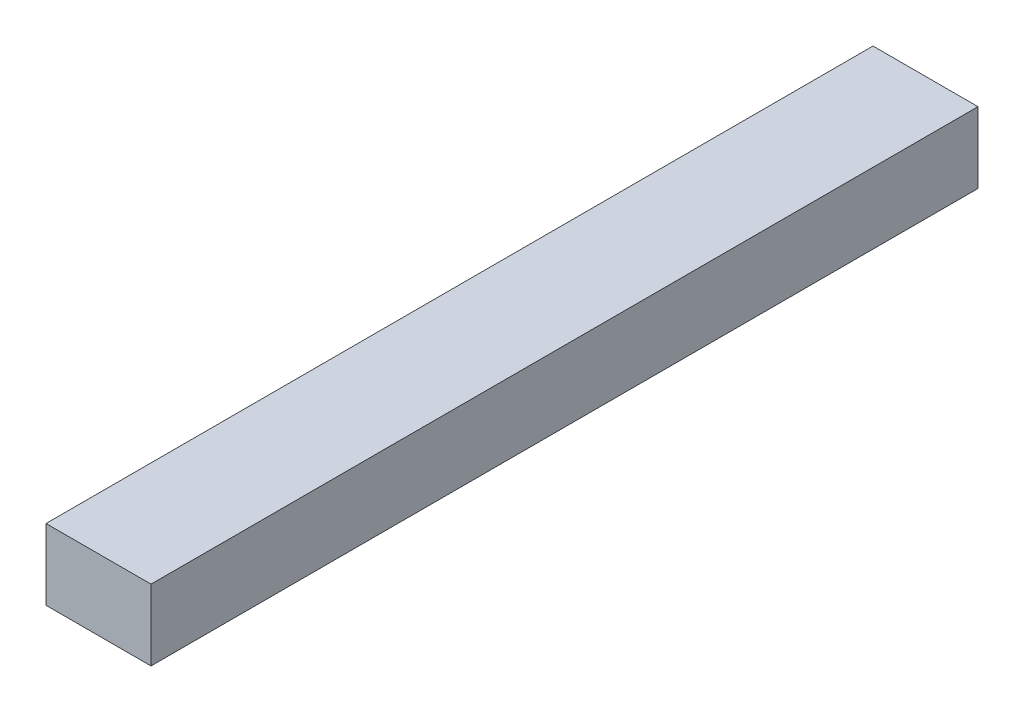
ISO-10303-21;
HEADER;
FILE_DESCRIPTION(('STEP AP214'),'2;1');
FILE_NAME('part.step','',(''),(''),'','','');
FILE_SCHEMA(('AUTOMOTIVE_DESIGN { 1 0 10303 214 1 1 1 1 }'));
ENDSEC;
DATA;
#1=APPLICATION_CONTEXT('core data for automotive mechanical design processes');
#2=APPLICATION_PROTOCOL_DEFINITION('international standard','automotive_design',2000,#1);
#3=PRODUCT_CONTEXT('',#1,'mechanical');
#4=PRODUCT('Part','Part','',(#3));
#5=PRODUCT_RELATED_PRODUCT_CATEGORY('part','',(#4));
#6=PRODUCT_DEFINITION_FORMATION('','',#4);
#7=PRODUCT_DEFINITION_CONTEXT('part definition',#1,'design');
#8=PRODUCT_DEFINITION('design','',#6,#7);
#9=PRODUCT_DEFINITION_SHAPE('','',#8);
#10=(LENGTH_UNIT() NAMED_UNIT(*) SI_UNIT(.MILLI.,.METRE.));
#11=(NAMED_UNIT(*) PLANE_ANGLE_UNIT() SI_UNIT($,.RADIAN.));
#12=(NAMED_UNIT(*) SI_UNIT($,.STERADIAN.) SOLID_ANGLE_UNIT());
#13=UNCERTAINTY_MEASURE_WITH_UNIT(LENGTH_MEASURE(1.E-05),#10,'distance_accuracy_value','');
#14=(GEOMETRIC_REPRESENTATION_CONTEXT(3) GLOBAL_UNCERTAINTY_ASSIGNED_CONTEXT((#13)) GLOBAL_UNIT_ASSIGNED_CONTEXT((#10,
#11,#12)) REPRESENTATION_CONTEXT('',''));
#15=CARTESIAN_POINT('',(0.,0.,0.));
#16=DIRECTION('',(0.,0.,1.));
#17=DIRECTION('',(1.,0.,0.));
#18=AXIS2_PLACEMENT_3D('',#15,#16,#17);
#19=CARTESIAN_POINT('',(75.9999999999999,107.811810474459,0.));
#20=DIRECTION('',(-1.,0.,0.));
#21=DIRECTION('',(0.,0.,1.));
#22=AXIS2_PLACEMENT_3D('',#19,#20,#21);
#23=PLANE('',#22);
#24=DIRECTION('',(0.,0.,-1.));
#25=VECTOR('',#24,1.);
#26=CARTESIAN_POINT('',(75.9999999999999,-19.2,0.));
#27=LINE('',#26,#25);
#28=CARTESIAN_POINT('',(75.9999999999999,-19.2,60.));
#29=VERTEX_POINT('',#28);
#30=CARTESIAN_POINT('',(75.9999999999999,-19.2,-66.));
#31=VERTEX_POINT('',#30);
#32=EDGE_CURVE('E11',#29,#31,#27,.T.);
#33=ORIENTED_EDGE('',*,*,#32,.F.);
#34=DIRECTION('',(0.,-1.,0.));
#35=VECTOR('',#34,1.);
#36=CARTESIAN_POINT('',(75.9999999999999,107.811810474459,60.));
#37=LINE('',#36,#35);
#38=CARTESIAN_POINT('',(75.9999999999999,-29.999999675218,60.));
#39=VERTEX_POINT('',#38);
#40=EDGE_CURVE('E45',#29,#39,#37,.T.);
#41=ORIENTED_EDGE('',*,*,#40,.T.);
#42=DIRECTION('',(0.,0.,-1.));
#43=VECTOR('',#42,1.);
#44=CARTESIAN_POINT('',(75.9999999999999,-29.999999675218,0.));
#45=LINE('',#44,#43);
#46=CARTESIAN_POINT('',(75.9999999999999,-29.999999675218,-66.));
#47=VERTEX_POINT('',#46);
#48=EDGE_CURVE('E106',#39,#47,#45,.T.);
#49=ORIENTED_EDGE('',*,*,#48,.T.);
#50=DIRECTION('',(0.,-1.,0.));
#51=VECTOR('',#50,1.);
#52=CARTESIAN_POINT('',(75.9999999999999,107.811810474459,-66.));
#53=LINE('',#52,#51);
#54=EDGE_CURVE('E100',#31,#47,#53,.T.);
#55=ORIENTED_EDGE('',*,*,#54,.F.);
#56=EDGE_LOOP('',(#33,#41,#49,#55));
#57=FACE_BOUND('',#56,.T.);
#58=ADVANCED_FACE('F41',(#57),#23,.F.);
#59=CARTESIAN_POINT('',(0.,107.811810474459,-66.));
#60=DIRECTION('',(0.,0.,-1.));
#61=DIRECTION('',(-1.,0.,0.));
#62=AXIS2_PLACEMENT_3D('',#59,#60,#61);
#63=PLANE('',#62);
#64=DIRECTION('',(0.,-1.,0.));
#65=VECTOR('',#64,1.);
#66=CARTESIAN_POINT('',(59.9999999999999,107.811810474459,-66.));
#67=LINE('',#66,#65);
#68=CARTESIAN_POINT('',(59.9999999999999,-19.2,-66.));
#69=VERTEX_POINT('',#68);
#70=CARTESIAN_POINT('',(59.9999999999999,-29.999999675218,-66.));
#71=VERTEX_POINT('',#70);
#72=EDGE_CURVE('E94',#69,#71,#67,.T.);
#73=ORIENTED_EDGE('',*,*,#72,.F.);
#74=DIRECTION('',(1.,0.,0.));
#75=VECTOR('',#74,1.);
#76=CARTESIAN_POINT('',(0.,-19.2,-66.));
#77=LINE('',#76,#75);
#78=EDGE_CURVE('E80',#69,#31,#77,.T.);
#79=ORIENTED_EDGE('',*,*,#78,.T.);
#80=ORIENTED_EDGE('',*,*,#54,.T.);
#81=DIRECTION('',(1.,0.,0.));
#82=VECTOR('',#81,1.);
#83=CARTESIAN_POINT('',(0.,-29.999999675218,-66.));
#84=LINE('',#83,#82);
#85=EDGE_CURVE('E98',#71,#47,#84,.T.);
#86=ORIENTED_EDGE('',*,*,#85,.F.);
#87=EDGE_LOOP('',(#73,#79,#80,#86));
#88=FACE_BOUND('',#87,.T.);
#89=ADVANCED_FACE('F115',(#88),#63,.T.);
#90=CARTESIAN_POINT('',(59.9999999999999,107.811810474459,0.));
#91=DIRECTION('',(-1.,0.,0.));
#92=DIRECTION('',(0.,0.,1.));
#93=AXIS2_PLACEMENT_3D('',#90,#91,#92);
#94=PLANE('',#93);
#95=DIRECTION('',(0.,-1.,0.));
#96=VECTOR('',#95,1.);
#97=CARTESIAN_POINT('',(59.9999999999999,107.811810474459,60.));
#98=LINE('',#97,#96);
#99=CARTESIAN_POINT('',(59.9999999999999,-19.2,60.));
#100=VERTEX_POINT('',#99);
#101=CARTESIAN_POINT('',(59.9999999999999,-29.999999675218,60.));
#102=VERTEX_POINT('',#101);
#103=EDGE_CURVE('E63',#100,#102,#98,.T.);
#104=ORIENTED_EDGE('',*,*,#103,.F.);
#105=DIRECTION('',(0.,0.,-1.));
#106=VECTOR('',#105,1.);
#107=CARTESIAN_POINT('',(59.9999999999999,-19.2,0.));
#108=LINE('',#107,#106);
#109=EDGE_CURVE('E88',#100,#69,#108,.T.);
#110=ORIENTED_EDGE('',*,*,#109,.T.);
#111=ORIENTED_EDGE('',*,*,#72,.T.);
#112=DIRECTION('',(0.,0.,-1.));
#113=VECTOR('',#112,1.);
#114=CARTESIAN_POINT('',(59.9999999999999,-29.999999675218,0.));
#115=LINE('',#114,#113);
#116=EDGE_CURVE('E92',#102,#71,#115,.T.);
#117=ORIENTED_EDGE('',*,*,#116,.F.);
#118=EDGE_LOOP('',(#104,#110,#111,#117));
#119=FACE_BOUND('',#118,.T.);
#120=ADVANCED_FACE('F90',(#119),#94,.T.);
#121=CARTESIAN_POINT('',(0.,107.811810474459,60.));
#122=DIRECTION('',(0.,0.,-1.));
#123=DIRECTION('',(-1.,0.,0.));
#124=AXIS2_PLACEMENT_3D('',#121,#122,#123);
#125=PLANE('',#124);
#126=DIRECTION('',(1.,0.,0.));
#127=VECTOR('',#126,1.);
#128=CARTESIAN_POINT('',(0.,-19.2,60.));
#129=LINE('',#128,#127);
#130=EDGE_CURVE('E50',#100,#29,#129,.T.);
#131=ORIENTED_EDGE('',*,*,#130,.F.);
#132=ORIENTED_EDGE('',*,*,#103,.T.);
#133=DIRECTION('',(1.,0.,0.));
#134=VECTOR('',#133,1.);
#135=CARTESIAN_POINT('',(0.,-29.999999675218,60.));
#136=LINE('',#135,#134);
#137=EDGE_CURVE('E93',#102,#39,#136,.T.);
#138=ORIENTED_EDGE('',*,*,#137,.T.);
#139=ORIENTED_EDGE('',*,*,#40,.F.);
#140=EDGE_LOOP('',(#131,#132,#138,#139));
#141=FACE_BOUND('',#140,.T.);
#142=ADVANCED_FACE('F96',(#141),#125,.F.);
#143=CARTESIAN_POINT('',(0.,-29.999999675218,0.));
#144=DIRECTION('',(0.,-1.,0.));
#145=DIRECTION('',(0.,0.,-1.));
#146=AXIS2_PLACEMENT_3D('',#143,#144,#145);
#147=PLANE('',#146);
#148=ORIENTED_EDGE('',*,*,#48,.F.);
#149=ORIENTED_EDGE('',*,*,#137,.F.);
#150=ORIENTED_EDGE('',*,*,#116,.T.);
#151=ORIENTED_EDGE('',*,*,#85,.T.);
#152=EDGE_LOOP('',(#148,#149,#150,#151));
#153=FACE_BOUND('',#152,.T.);
#154=ADVANCED_FACE('F112',(#153),#147,.T.);
#155=CARTESIAN_POINT('',(67.9999999999999,-19.2,-12.));
#156=DIRECTION('',(0.,1.,0.));
#157=DIRECTION('',(1.,0.,0.));
#158=AXIS2_PLACEMENT_3D('',#155,#156,#157);
#159=PLANE('',#158);
#160=ORIENTED_EDGE('',*,*,#130,.T.);
#161=ORIENTED_EDGE('',*,*,#32,.T.);
#162=ORIENTED_EDGE('',*,*,#78,.F.);
#163=ORIENTED_EDGE('',*,*,#109,.F.);
#164=EDGE_LOOP('',(#160,#161,#162,#163));
#165=FACE_BOUND('',#164,.T.);
#166=ADVANCED_FACE('F43',(#165),#159,.T.);
#167=CLOSED_SHELL('',(#58,#89,#120,#142,#154,#166));
#168=MANIFOLD_SOLID_BREP('B2',#167);
#169=ADVANCED_BREP_SHAPE_REPRESENTATION('',(#18,#168),#14);
#170=SHAPE_DEFINITION_REPRESENTATION(#9,#169);
ENDSEC;
END-ISO-10303-21;
